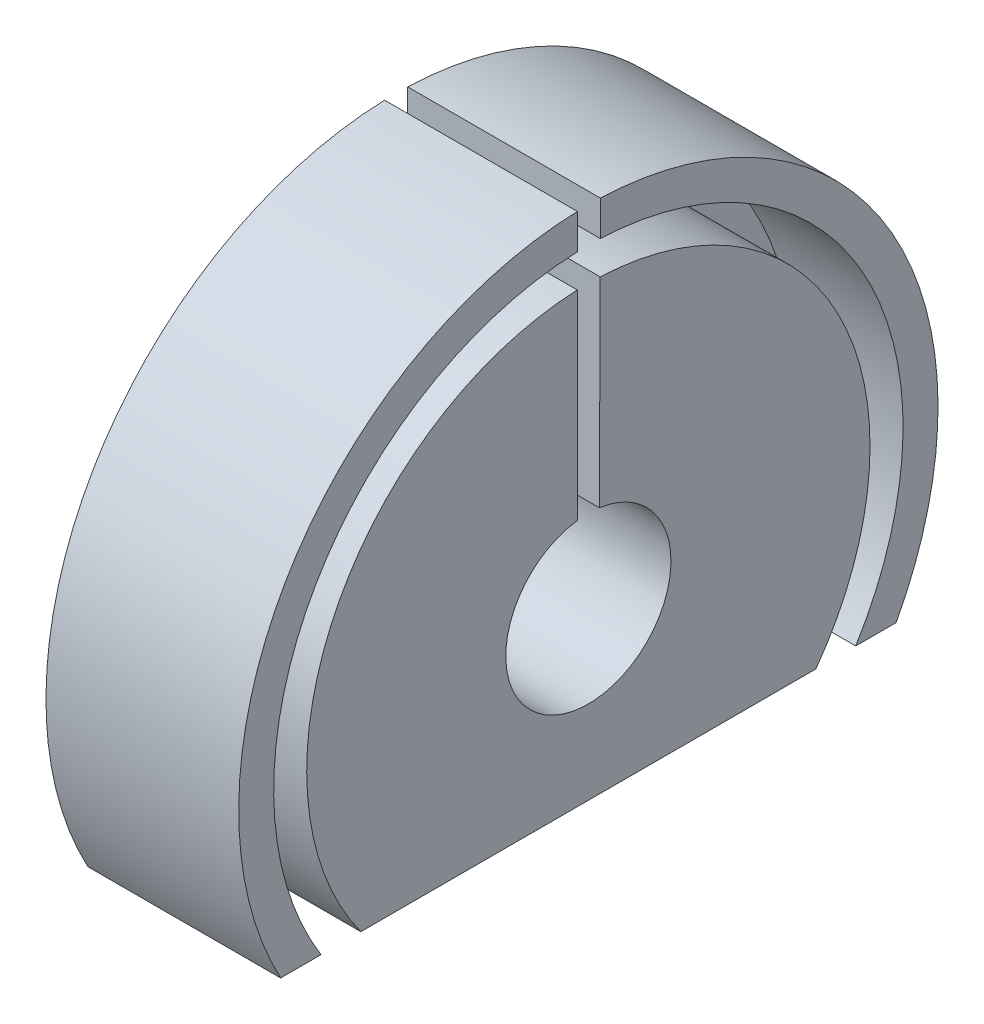
ISO-10303-21;
HEADER;
FILE_DESCRIPTION(('STEP AP214'),'2;1');
FILE_NAME('part.step','',(''),(''),'','','');
FILE_SCHEMA(('AUTOMOTIVE_DESIGN { 1 0 10303 214 1 1 1 1 }'));
ENDSEC;
DATA;
#1=APPLICATION_CONTEXT('core data for automotive mechanical design processes');
#2=APPLICATION_PROTOCOL_DEFINITION('international standard','automotive_design',2000,#1);
#3=PRODUCT_CONTEXT('',#1,'mechanical');
#4=PRODUCT('Part','Part','',(#3));
#5=PRODUCT_RELATED_PRODUCT_CATEGORY('part','',(#4));
#6=PRODUCT_DEFINITION_FORMATION('','',#4);
#7=PRODUCT_DEFINITION_CONTEXT('part definition',#1,'design');
#8=PRODUCT_DEFINITION('design','',#6,#7);
#9=PRODUCT_DEFINITION_SHAPE('','',#8);
#10=(LENGTH_UNIT() NAMED_UNIT(*) SI_UNIT(.MILLI.,.METRE.));
#11=(NAMED_UNIT(*) PLANE_ANGLE_UNIT() SI_UNIT($,.RADIAN.));
#12=(NAMED_UNIT(*) SI_UNIT($,.STERADIAN.) SOLID_ANGLE_UNIT());
#13=UNCERTAINTY_MEASURE_WITH_UNIT(LENGTH_MEASURE(1.E-05),#10,'distance_accuracy_value','');
#14=(GEOMETRIC_REPRESENTATION_CONTEXT(3) GLOBAL_UNCERTAINTY_ASSIGNED_CONTEXT((#13)) GLOBAL_UNIT_ASSIGNED_CONTEXT((#10,
#11,#12)) REPRESENTATION_CONTEXT('',''));
#15=CARTESIAN_POINT('',(0.,0.,0.));
#16=DIRECTION('',(0.,0.,1.));
#17=DIRECTION('',(1.,0.,0.));
#18=AXIS2_PLACEMENT_3D('',#15,#16,#17);
#19=CARTESIAN_POINT('',(35.,0.,0.));
#20=DIRECTION('',(-1.,0.,0.));
#21=DIRECTION('',(0.,0.,1.));
#22=AXIS2_PLACEMENT_3D('',#19,#20,#21);
#23=CYLINDRICAL_SURFACE('',#22,63.5);
#24=CARTESIAN_POINT('',(35.,0.,0.));
#25=DIRECTION('',(1.,0.,0.));
#26=DIRECTION('',(0.,0.,-1.));
#27=AXIS2_PLACEMENT_3D('',#24,#25,#26);
#28=CIRCLE('',#27,63.5);
#29=CARTESIAN_POINT('',(35.,-30.1479958641065,-55.8869246369651));
#30=VERTEX_POINT('',#29);
#31=CARTESIAN_POINT('',(35.,63.4619742229002,-2.19723183391003));
#32=VERTEX_POINT('',#31);
#33=EDGE_CURVE('E210',#30,#32,#28,.T.);
#34=ORIENTED_EDGE('',*,*,#33,.F.);
#35=DIRECTION('',(-1.,0.,0.));
#36=VECTOR('',#35,1.);
#37=CARTESIAN_POINT('',(35.,-30.1479958641065,-55.8869246369651));
#38=LINE('',#37,#36);
#39=CARTESIAN_POINT('',(0.,-30.1479958641065,-55.8869246369651));
#40=VERTEX_POINT('',#39);
#41=EDGE_CURVE('E195',#40,#30,#38,.F.);
#42=ORIENTED_EDGE('',*,*,#41,.F.);
#43=CARTESIAN_POINT('',(0.,0.,0.));
#44=DIRECTION('',(1.,0.,0.));
#45=DIRECTION('',(0.,0.,-1.));
#46=AXIS2_PLACEMENT_3D('',#43,#44,#45);
#47=CIRCLE('',#46,63.5);
#48=CARTESIAN_POINT('',(0.,63.4619742229002,-2.19723183391003));
#49=VERTEX_POINT('',#48);
#50=EDGE_CURVE('E208',#40,#49,#47,.T.);
#51=ORIENTED_EDGE('',*,*,#50,.T.);
#52=DIRECTION('',(-1.,0.,0.));
#53=VECTOR('',#52,1.);
#54=CARTESIAN_POINT('',(35.,63.4619742229002,-2.19723183391003));
#55=LINE('',#54,#53);
#56=EDGE_CURVE('E230',#32,#49,#55,.T.);
#57=ORIENTED_EDGE('',*,*,#56,.F.);
#58=EDGE_LOOP('',(#34,#42,#51,#57));
#59=FACE_BOUND('',#58,.T.);
#60=ADVANCED_FACE('F43',(#59),#23,.T.);
#61=CARTESIAN_POINT('',(35.,0.,0.));
#62=DIRECTION('',(1.,0.,0.));
#63=DIRECTION('',(0.,0.,-1.));
#64=AXIS2_PLACEMENT_3D('',#61,#62,#63);
#65=PLANE('',#64);
#66=DIRECTION('',(0.,0.,-1.));
#67=VECTOR('',#66,1.);
#68=CARTESIAN_POINT('',(35.,-30.1479958641065,-77.1974220797906));
#69=LINE('',#68,#67);
#70=CARTESIAN_POINT('',(35.,-30.1479958641065,-48.5512187836497));
#71=VERTEX_POINT('',#70);
#72=EDGE_CURVE('E364',#71,#30,#69,.T.);
#73=ORIENTED_EDGE('',*,*,#72,.T.);
#74=ORIENTED_EDGE('',*,*,#33,.T.);
#75=DIRECTION('',(0.,-0.999991763943684,0.00405857669627427));
#76=VECTOR('',#75,1.);
#77=CARTESIAN_POINT('',(35.,14.8660687473185,-2.));
#78=LINE('',#77,#76);
#79=CARTESIAN_POINT('',(35.,57.1087324328507,-2.1714465024657));
#80=VERTEX_POINT('',#79);
#81=EDGE_CURVE('E231',#32,#80,#78,.T.);
#82=ORIENTED_EDGE('',*,*,#81,.T.);
#83=CARTESIAN_POINT('',(35.,0.,0.));
#84=DIRECTION('',(1.,0.,0.));
#85=DIRECTION('',(0.,0.,-1.));
#86=AXIS2_PLACEMENT_3D('',#83,#84,#85);
#87=CIRCLE('',#86,57.15);
#88=EDGE_CURVE('E51',#80,#71,#87,.F.);
#89=ORIENTED_EDGE('',*,*,#88,.T.);
#90=EDGE_LOOP('',(#73,#74,#82,#89));
#91=FACE_BOUND('',#90,.T.);
#92=ADVANCED_FACE('F399',(#91),#65,.T.);
#93=CARTESIAN_POINT('',(15.,0.,0.));
#94=DIRECTION('',(-1.,0.,0.));
#95=DIRECTION('',(0.,0.,1.));
#96=AXIS2_PLACEMENT_3D('',#93,#94,#95);
#97=PLANE('',#96);
#98=CARTESIAN_POINT('',(15.,0.,0.));
#99=DIRECTION('',(-1.,0.,0.));
#100=DIRECTION('',(0.,0.,1.));
#101=AXIS2_PLACEMENT_3D('',#98,#99,#100);
#102=CIRCLE('',#101,57.15);
#103=CARTESIAN_POINT('',(15.,-30.1479958641065,48.5512187836497));
#104=VERTEX_POINT('',#103);
#105=CARTESIAN_POINT('',(15.,57.1149936531556,2.));
#106=VERTEX_POINT('',#105);
#107=EDGE_CURVE('E261',#104,#106,#102,.T.);
#108=ORIENTED_EDGE('',*,*,#107,.F.);
#109=DIRECTION('',(0.,0.,1.));
#110=VECTOR('',#109,1.);
#111=CARTESIAN_POINT('',(15.,-30.1479958641065,-77.1974220797906));
#112=LINE('',#111,#110);
#113=CARTESIAN_POINT('',(15.,-30.1479958641065,41.320949231326));
#114=VERTEX_POINT('',#113);
#115=EDGE_CURVE('E366',#114,#104,#112,.T.);
#116=ORIENTED_EDGE('',*,*,#115,.F.);
#117=CARTESIAN_POINT('',(15.,0.,0.));
#118=DIRECTION('',(-1.,0.,0.));
#119=DIRECTION('',(0.,0.,1.));
#120=AXIS2_PLACEMENT_3D('',#117,#118,#119);
#121=CIRCLE('',#120,51.15);
#122=CARTESIAN_POINT('',(15.,51.1108843594004,2.));
#123=VERTEX_POINT('',#122);
#124=EDGE_CURVE('E361',#114,#123,#121,.T.);
#125=ORIENTED_EDGE('',*,*,#124,.T.);
#126=DIRECTION('',(0.,-1.,0.));
#127=VECTOR('',#126,1.);
#128=CARTESIAN_POINT('',(15.,14.8660687473185,2.));
#129=LINE('',#128,#127);
#130=EDGE_CURVE('E265',#106,#123,#129,.T.);
#131=ORIENTED_EDGE('',*,*,#130,.F.);
#132=EDGE_LOOP('',(#108,#116,#125,#131));
#133=FACE_BOUND('',#132,.T.);
#134=ADVANCED_FACE('F405',(#133),#97,.F.);
#135=CARTESIAN_POINT('',(15.,0.,0.));
#136=DIRECTION('',(1.,0.,0.));
#137=DIRECTION('',(0.,0.,-1.));
#138=AXIS2_PLACEMENT_3D('',#135,#136,#137);
#139=CYLINDRICAL_SURFACE('',#138,57.15);
#140=DIRECTION('',(1.,0.,0.));
#141=VECTOR('',#140,1.);
#142=CARTESIAN_POINT('',(15.,-30.1479958641065,48.5512187836497));
#143=LINE('',#142,#141);
#144=CARTESIAN_POINT('',(35.,-30.1479958641065,48.5512187836497));
#145=VERTEX_POINT('',#144);
#146=EDGE_CURVE('E362',#145,#104,#143,.F.);
#147=ORIENTED_EDGE('',*,*,#146,.T.);
#148=ORIENTED_EDGE('',*,*,#107,.T.);
#149=DIRECTION('',(1.,0.,0.));
#150=VECTOR('',#149,1.);
#151=CARTESIAN_POINT('',(15.,57.1149936531556,2.));
#152=LINE('',#151,#150);
#153=CARTESIAN_POINT('',(35.,57.1149936531556,2.));
#154=VERTEX_POINT('',#153);
#155=EDGE_CURVE('E258',#106,#154,#152,.T.);
#156=ORIENTED_EDGE('',*,*,#155,.T.);
#157=EDGE_CURVE('E241',#145,#154,#87,.F.);
#158=ORIENTED_EDGE('',*,*,#157,.F.);
#159=EDGE_LOOP('',(#147,#148,#156,#158));
#160=FACE_BOUND('',#159,.T.);
#161=ADVANCED_FACE('F259',(#160),#139,.F.);
#162=CARTESIAN_POINT('',(15.,0.,0.));
#163=DIRECTION('',(1.,0.,0.));
#164=DIRECTION('',(0.,0.,-1.));
#165=AXIS2_PLACEMENT_3D('',#162,#163,#164);
#166=CYLINDRICAL_SURFACE('',#165,51.15);
#167=ORIENTED_EDGE('',*,*,#124,.F.);
#168=DIRECTION('',(1.,0.,0.));
#169=VECTOR('',#168,1.);
#170=CARTESIAN_POINT('',(15.,-30.1479958641065,41.320949231326));
#171=LINE('',#170,#169);
#172=CARTESIAN_POINT('',(35.,-30.1479958641065,41.320949231326));
#173=VERTEX_POINT('',#172);
#174=EDGE_CURVE('E370',#173,#114,#171,.F.);
#175=ORIENTED_EDGE('',*,*,#174,.F.);
#176=CARTESIAN_POINT('',(35.,0.,0.));
#177=DIRECTION('',(1.,0.,0.));
#178=DIRECTION('',(0.,0.,-1.));
#179=AXIS2_PLACEMENT_3D('',#176,#177,#178);
#180=CIRCLE('',#179,51.15);
#181=CARTESIAN_POINT('',(35.,51.1108843594004,2.));
#182=VERTEX_POINT('',#181);
#183=EDGE_CURVE('E239',#173,#182,#180,.F.);
#184=ORIENTED_EDGE('',*,*,#183,.T.);
#185=DIRECTION('',(1.,0.,0.));
#186=VECTOR('',#185,1.);
#187=CARTESIAN_POINT('',(15.,51.1108843594004,2.));
#188=LINE('',#187,#186);
#189=EDGE_CURVE('E351',#123,#182,#188,.T.);
#190=ORIENTED_EDGE('',*,*,#189,.F.);
#191=EDGE_LOOP('',(#167,#175,#184,#190));
#192=FACE_BOUND('',#191,.T.);
#193=ADVANCED_FACE('F386',(#192),#166,.T.);
#194=CARTESIAN_POINT('',(35.,14.8660687473185,2.));
#195=DIRECTION('',(0.,0.,1.));
#196=DIRECTION('',(1.,0.,0.));
#197=AXIS2_PLACEMENT_3D('',#194,#195,#196);
#198=PLANE('',#197);
#199=ORIENTED_EDGE('',*,*,#155,.F.);
#200=ORIENTED_EDGE('',*,*,#130,.T.);
#201=ORIENTED_EDGE('',*,*,#189,.T.);
#202=DIRECTION('',(0.,1.,0.));
#203=VECTOR('',#202,1.);
#204=CARTESIAN_POINT('',(35.,14.8660687473185,2.));
#205=LINE('',#204,#203);
#206=CARTESIAN_POINT('',(35.,14.8660687473185,2.));
#207=VERTEX_POINT('',#206);
#208=EDGE_CURVE('E270',#207,#182,#205,.T.);
#209=ORIENTED_EDGE('',*,*,#208,.F.);
#210=DIRECTION('',(-1.,0.,0.));
#211=VECTOR('',#210,1.);
#212=CARTESIAN_POINT('',(35.,14.8660687473185,2.));
#213=LINE('',#212,#211);
#214=CARTESIAN_POINT('',(0.,14.8660687473185,2.));
#215=VERTEX_POINT('',#214);
#216=EDGE_CURVE('E236',#207,#215,#213,.T.);
#217=ORIENTED_EDGE('',*,*,#216,.T.);
#218=DIRECTION('',(0.,1.,0.));
#219=VECTOR('',#218,1.);
#220=CARTESIAN_POINT('',(0.,14.8660687473185,2.));
#221=LINE('',#220,#219);
#222=CARTESIAN_POINT('',(0.,19.8997487421324,2.));
#223=VERTEX_POINT('',#222);
#224=EDGE_CURVE('E217',#215,#223,#221,.T.);
#225=ORIENTED_EDGE('',*,*,#224,.T.);
#226=DIRECTION('',(1.,0.,0.));
#227=VECTOR('',#226,1.);
#228=CARTESIAN_POINT('',(-12.,19.8997487421324,2.));
#229=LINE('',#228,#227);
#230=CARTESIAN_POINT('',(-12.,19.8997487421324,2.));
#231=VERTEX_POINT('',#230);
#232=EDGE_CURVE('E282',#231,#223,#229,.T.);
#233=ORIENTED_EDGE('',*,*,#232,.F.);
#234=DIRECTION('',(0.,-1.,0.));
#235=VECTOR('',#234,1.);
#236=CARTESIAN_POINT('',(-12.,19.8997487421324,2.));
#237=LINE('',#236,#235);
#238=CARTESIAN_POINT('',(-12.,43.7622417399744,2.));
#239=VERTEX_POINT('',#238);
#240=EDGE_CURVE('E316',#239,#231,#237,.T.);
#241=ORIENTED_EDGE('',*,*,#240,.F.);
#242=DIRECTION('',(1.,0.,0.));
#243=VECTOR('',#242,1.);
#244=CARTESIAN_POINT('',(-12.,43.7622417399744,2.));
#245=LINE('',#244,#243);
#246=CARTESIAN_POINT('',(0.,43.7622417399744,2.));
#247=VERTEX_POINT('',#246);
#248=EDGE_CURVE('E309',#239,#247,#245,.T.);
#249=ORIENTED_EDGE('',*,*,#248,.T.);
#250=CARTESIAN_POINT('',(0.,63.4684961220919,2.));
#251=VERTEX_POINT('',#250);
#252=EDGE_CURVE('E221',#247,#251,#221,.T.);
#253=ORIENTED_EDGE('',*,*,#252,.T.);
#254=DIRECTION('',(-1.,0.,0.));
#255=VECTOR('',#254,1.);
#256=CARTESIAN_POINT('',(35.,63.4684961220919,2.));
#257=LINE('',#256,#255);
#258=CARTESIAN_POINT('',(35.,63.4684961220919,2.));
#259=VERTEX_POINT('',#258);
#260=EDGE_CURVE('E233',#259,#251,#257,.T.);
#261=ORIENTED_EDGE('',*,*,#260,.F.);
#262=EDGE_CURVE('E252',#154,#259,#205,.T.);
#263=ORIENTED_EDGE('',*,*,#262,.F.);
#264=EDGE_LOOP('',(#199,#200,#201,#209,#217,#225,#233,#241,#249,#253,#261,#263));
#265=FACE_BOUND('',#264,.T.);
#266=ADVANCED_FACE('F268',(#265),#198,.F.);
#267=CARTESIAN_POINT('',(35.,14.8660687473185,-2.));
#268=DIRECTION('',(0.,-0.00405857669627427,-0.999991763943684));
#269=DIRECTION('',(0.,0.999991763943684,-0.00405857669627427));
#270=AXIS2_PLACEMENT_3D('',#267,#268,#269);
#271=PLANE('',#270);
#272=DIRECTION('',(1.,0.,0.));
#273=VECTOR('',#272,1.);
#274=CARTESIAN_POINT('',(15.,57.1087324328507,-2.1714465024657));
#275=LINE('',#274,#273);
#276=CARTESIAN_POINT('',(15.,57.1087324328507,-2.1714465024657));
#277=VERTEX_POINT('',#276);
#278=EDGE_CURVE('E266',#80,#277,#275,.F.);
#279=ORIENTED_EDGE('',*,*,#278,.F.);
#280=ORIENTED_EDGE('',*,*,#81,.F.);
#281=ORIENTED_EDGE('',*,*,#56,.T.);
#282=DIRECTION('',(0.,-0.999991763943684,0.00405857669627427));
#283=VECTOR('',#282,1.);
#284=CARTESIAN_POINT('',(0.,14.8660687473185,-2.));
#285=LINE('',#284,#283);
#286=CARTESIAN_POINT('',(0.,43.762241739982,-2.1172783002302));
#287=VERTEX_POINT('',#286);
#288=EDGE_CURVE('E215',#49,#287,#285,.T.);
#289=ORIENTED_EDGE('',*,*,#288,.T.);
#290=CARTESIAN_POINT('',(0.,14.8660687473185,-2.));
#291=VERTEX_POINT('',#290);
#292=EDGE_CURVE('E219',#287,#291,#285,.T.);
#293=ORIENTED_EDGE('',*,*,#292,.T.);
#294=DIRECTION('',(-1.,0.,0.));
#295=VECTOR('',#294,1.);
#296=CARTESIAN_POINT('',(35.,14.8660687473185,-2.));
#297=LINE('',#296,#295);
#298=CARTESIAN_POINT('',(35.,14.8660687473185,-2.));
#299=VERTEX_POINT('',#298);
#300=EDGE_CURVE('E227',#299,#291,#297,.T.);
#301=ORIENTED_EDGE('',*,*,#300,.F.);
#302=CARTESIAN_POINT('',(35.,51.1049170847186,-2.14707935671585));
#303=VERTEX_POINT('',#302);
#304=EDGE_CURVE('E279',#303,#299,#78,.T.);
#305=ORIENTED_EDGE('',*,*,#304,.F.);
#306=DIRECTION('',(1.,0.,0.));
#307=VECTOR('',#306,1.);
#308=CARTESIAN_POINT('',(15.,51.1049170847186,-2.14707935671585));
#309=LINE('',#308,#307);
#310=CARTESIAN_POINT('',(15.,51.1049170847186,-2.14707935671585));
#311=VERTEX_POINT('',#310);
#312=EDGE_CURVE('E66',#303,#311,#309,.F.);
#313=ORIENTED_EDGE('',*,*,#312,.T.);
#314=DIRECTION('',(0.,0.999991763943684,-0.00405857669627427));
#315=VECTOR('',#314,1.);
#316=CARTESIAN_POINT('',(15.,14.8660687473185,-2.));
#317=LINE('',#316,#315);
#318=EDGE_CURVE('E13',#311,#277,#317,.T.);
#319=ORIENTED_EDGE('',*,*,#318,.T.);
#320=EDGE_LOOP('',(#279,#280,#281,#289,#293,#301,#305,#313,#319));
#321=FACE_BOUND('',#320,.T.);
#322=ADVANCED_FACE('F455',(#321),#271,.F.);
#323=DIRECTION('',(0.,0.,-1.));
#324=VECTOR('',#323,1.);
#325=CARTESIAN_POINT('',(35.,-30.1479958641065,-77.1974220797906));
#326=LINE('',#325,#324);
#327=CARTESIAN_POINT('',(35.,-30.1479958641065,-41.320949231326));
#328=VERTEX_POINT('',#327);
#329=EDGE_CURVE('E372',#173,#328,#326,.T.);
#330=ORIENTED_EDGE('',*,*,#329,.T.);
#331=EDGE_CURVE('E240',#303,#328,#180,.F.);
#332=ORIENTED_EDGE('',*,*,#331,.F.);
#333=ORIENTED_EDGE('',*,*,#304,.T.);
#334=CARTESIAN_POINT('',(35.,0.,0.));
#335=DIRECTION('',(-1.,0.,0.));
#336=DIRECTION('',(0.,0.,-1.));
#337=AXIS2_PLACEMENT_3D('',#334,#335,#336);
#338=CIRCLE('',#337,15.);
#339=EDGE_CURVE('E226',#299,#207,#338,.T.);
#340=ORIENTED_EDGE('',*,*,#339,.T.);
#341=ORIENTED_EDGE('',*,*,#208,.T.);
#342=ORIENTED_EDGE('',*,*,#183,.F.);
#343=EDGE_LOOP('',(#330,#332,#333,#340,#341,#342));
#344=FACE_BOUND('',#343,.T.);
#345=ADVANCED_FACE('F380',(#344),#65,.T.);
#346=CARTESIAN_POINT('',(0.,0.,0.));
#347=DIRECTION('',(1.,0.,0.));
#348=DIRECTION('',(0.,0.,-1.));
#349=AXIS2_PLACEMENT_3D('',#346,#347,#348);
#350=PLANE('',#349);
#351=ORIENTED_EDGE('',*,*,#50,.F.);
#352=DIRECTION('',(0.,0.,-1.));
#353=VECTOR('',#352,1.);
#354=CARTESIAN_POINT('',(0.,-30.1479958641065,-77.1974220797906));
#355=LINE('',#354,#353);
#356=CARTESIAN_POINT('',(0.,-30.1479958641065,55.8869246369651));
#357=VERTEX_POINT('',#356);
#358=EDGE_CURVE('E192',#357,#40,#355,.T.);
#359=ORIENTED_EDGE('',*,*,#358,.F.);
#360=EDGE_CURVE('E216',#251,#357,#47,.T.);
#361=ORIENTED_EDGE('',*,*,#360,.F.);
#362=ORIENTED_EDGE('',*,*,#252,.F.);
#363=DIRECTION('',(0.,0.,-1.));
#364=VECTOR('',#363,1.);
#365=CARTESIAN_POINT('',(0.,43.7622417399744,12.9131853004783));
#366=LINE('',#365,#364);
#367=CARTESIAN_POINT('',(0.,43.7622417399744,12.9131853004783));
#368=VERTEX_POINT('',#367);
#369=EDGE_CURVE('E313',#368,#247,#366,.T.);
#370=ORIENTED_EDGE('',*,*,#369,.F.);
#371=DIRECTION('',(0.,1.,0.));
#372=VECTOR('',#371,1.);
#373=CARTESIAN_POINT('',(0.,43.7622417399744,12.9131853004783));
#374=LINE('',#373,#372);
#375=CARTESIAN_POINT('',(0.,27.0785827804099,12.9131853004783));
#376=VERTEX_POINT('',#375);
#377=EDGE_CURVE('E317',#376,#368,#374,.T.);
#378=ORIENTED_EDGE('',*,*,#377,.F.);
#379=CARTESIAN_POINT('',(0.,0.,0.));
#380=DIRECTION('',(-1.,0.,0.));
#381=DIRECTION('',(0.,0.,1.));
#382=AXIS2_PLACEMENT_3D('',#379,#380,#381);
#383=CIRCLE('',#382,30.);
#384=CARTESIAN_POINT('',(0.,27.0785827804099,-12.9131853004783));
#385=VERTEX_POINT('',#384);
#386=EDGE_CURVE('E320',#385,#376,#383,.T.);
#387=ORIENTED_EDGE('',*,*,#386,.F.);
#388=DIRECTION('',(0.,-1.,0.));
#389=VECTOR('',#388,1.);
#390=CARTESIAN_POINT('',(0.,43.7622417399744,-12.9131853004783));
#391=LINE('',#390,#389);
#392=CARTESIAN_POINT('',(0.,43.7622417399744,-12.9131853004783));
#393=VERTEX_POINT('',#392);
#394=EDGE_CURVE('E323',#393,#385,#391,.T.);
#395=ORIENTED_EDGE('',*,*,#394,.F.);
#396=DIRECTION('',(0.,0.,-1.));
#397=VECTOR('',#396,1.);
#398=CARTESIAN_POINT('',(0.,43.7622417399744,-2.11727830023019));
#399=LINE('',#398,#397);
#400=EDGE_CURVE('E326',#287,#393,#399,.T.);
#401=ORIENTED_EDGE('',*,*,#400,.F.);
#402=ORIENTED_EDGE('',*,*,#288,.F.);
#403=EDGE_LOOP('',(#351,#359,#361,#362,#370,#378,#387,#395,#401,#402));
#404=FACE_BOUND('',#403,.T.);
#405=ADVANCED_FACE('F213',(#404),#350,.F.);
#406=DIRECTION('',(0.,1.,0.));
#407=VECTOR('',#406,1.);
#408=CARTESIAN_POINT('',(0.,19.8876125414635,-2.11727830023019));
#409=LINE('',#408,#407);
#410=CARTESIAN_POINT('',(0.,19.8876125414635,-2.11727830023019));
#411=VERTEX_POINT('',#410);
#412=EDGE_CURVE('E329',#411,#287,#409,.T.);
#413=ORIENTED_EDGE('',*,*,#412,.F.);
#414=CARTESIAN_POINT('',(0.,0.,0.));
#415=DIRECTION('',(1.,0.,0.));
#416=DIRECTION('',(0.,0.,1.));
#417=AXIS2_PLACEMENT_3D('',#414,#415,#416);
#418=CIRCLE('',#417,20.);
#419=EDGE_CURVE('E332',#223,#411,#418,.T.);
#420=ORIENTED_EDGE('',*,*,#419,.F.);
#421=ORIENTED_EDGE('',*,*,#224,.F.);
#422=CARTESIAN_POINT('',(0.,0.,0.));
#423=DIRECTION('',(-1.,0.,0.));
#424=DIRECTION('',(0.,0.,-1.));
#425=AXIS2_PLACEMENT_3D('',#422,#423,#424);
#426=CIRCLE('',#425,15.);
#427=EDGE_CURVE('E280',#291,#215,#426,.T.);
#428=ORIENTED_EDGE('',*,*,#427,.F.);
#429=ORIENTED_EDGE('',*,*,#292,.F.);
#430=EDGE_LOOP('',(#413,#420,#421,#428,#429));
#431=FACE_BOUND('',#430,.T.);
#432=ADVANCED_FACE('F415',(#431),#350,.F.);
#433=CARTESIAN_POINT('',(35.,0.,0.));
#434=DIRECTION('',(-1.,0.,0.));
#435=DIRECTION('',(0.,0.,1.));
#436=AXIS2_PLACEMENT_3D('',#433,#434,#435);
#437=CYLINDRICAL_SURFACE('',#436,15.);
#438=ORIENTED_EDGE('',*,*,#427,.T.);
#439=ORIENTED_EDGE('',*,*,#216,.F.);
#440=ORIENTED_EDGE('',*,*,#339,.F.);
#441=ORIENTED_EDGE('',*,*,#300,.T.);
#442=EDGE_LOOP('',(#438,#439,#440,#441));
#443=FACE_BOUND('',#442,.T.);
#444=ADVANCED_FACE('F45',(#443),#437,.F.);
#445=ORIENTED_EDGE('',*,*,#360,.T.);
#446=DIRECTION('',(-1.,0.,0.));
#447=VECTOR('',#446,1.);
#448=CARTESIAN_POINT('',(35.,-30.1479958641065,55.8869246369651));
#449=LINE('',#448,#447);
#450=CARTESIAN_POINT('',(35.,-30.1479958641065,55.8869246369651));
#451=VERTEX_POINT('',#450);
#452=EDGE_CURVE('E198',#451,#357,#449,.T.);
#453=ORIENTED_EDGE('',*,*,#452,.F.);
#454=EDGE_CURVE('E277',#259,#451,#28,.T.);
#455=ORIENTED_EDGE('',*,*,#454,.F.);
#456=ORIENTED_EDGE('',*,*,#260,.T.);
#457=EDGE_LOOP('',(#445,#453,#455,#456));
#458=FACE_BOUND('',#457,.T.);
#459=ADVANCED_FACE('F401',(#458),#23,.T.);
#460=EDGE_CURVE('E254',#451,#145,#69,.T.);
#461=ORIENTED_EDGE('',*,*,#460,.T.);
#462=ORIENTED_EDGE('',*,*,#157,.T.);
#463=ORIENTED_EDGE('',*,*,#262,.T.);
#464=ORIENTED_EDGE('',*,*,#454,.T.);
#465=EDGE_LOOP('',(#461,#462,#463,#464));
#466=FACE_BOUND('',#465,.T.);
#467=ADVANCED_FACE('F249',(#466),#65,.T.);
#468=CARTESIAN_POINT('',(-12.,0.,0.));
#469=DIRECTION('',(1.,0.,0.));
#470=DIRECTION('',(0.,0.,-1.));
#471=AXIS2_PLACEMENT_3D('',#468,#469,#470);
#472=CYLINDRICAL_SURFACE('',#471,20.);
#473=ORIENTED_EDGE('',*,*,#419,.T.);
#474=DIRECTION('',(1.,0.,0.));
#475=VECTOR('',#474,1.);
#476=CARTESIAN_POINT('',(-12.,19.8876125414635,-2.11727830023019));
#477=LINE('',#476,#475);
#478=CARTESIAN_POINT('',(-12.,19.8876125414635,-2.11727830023019));
#479=VERTEX_POINT('',#478);
#480=EDGE_CURVE('E287',#479,#411,#477,.T.);
#481=ORIENTED_EDGE('',*,*,#480,.F.);
#482=CARTESIAN_POINT('',(-12.,0.,0.));
#483=DIRECTION('',(1.,0.,0.));
#484=DIRECTION('',(0.,0.,1.));
#485=AXIS2_PLACEMENT_3D('',#482,#483,#484);
#486=CIRCLE('',#485,20.);
#487=EDGE_CURVE('E345',#231,#479,#486,.T.);
#488=ORIENTED_EDGE('',*,*,#487,.F.);
#489=ORIENTED_EDGE('',*,*,#232,.T.);
#490=EDGE_LOOP('',(#473,#481,#488,#489));
#491=FACE_BOUND('',#490,.T.);
#492=ADVANCED_FACE('F414',(#491),#472,.F.);
#493=CARTESIAN_POINT('',(-12.,19.8876125414635,-2.11727830023019));
#494=DIRECTION('',(0.,0.,-1.));
#495=DIRECTION('',(-1.,0.,0.));
#496=AXIS2_PLACEMENT_3D('',#493,#494,#495);
#497=PLANE('',#496);
#498=ORIENTED_EDGE('',*,*,#412,.T.);
#499=DIRECTION('',(1.,0.,0.));
#500=VECTOR('',#499,1.);
#501=CARTESIAN_POINT('',(-12.,43.7622417399744,-2.11727830023019));
#502=LINE('',#501,#500);
#503=CARTESIAN_POINT('',(-12.,43.7622417399744,-2.11727830023019));
#504=VERTEX_POINT('',#503);
#505=EDGE_CURVE('E292',#504,#287,#502,.T.);
#506=ORIENTED_EDGE('',*,*,#505,.F.);
#507=DIRECTION('',(0.,1.,0.));
#508=VECTOR('',#507,1.);
#509=CARTESIAN_POINT('',(-12.,19.8876125414635,-2.11727830023019));
#510=LINE('',#509,#508);
#511=EDGE_CURVE('E343',#479,#504,#510,.T.);
#512=ORIENTED_EDGE('',*,*,#511,.F.);
#513=ORIENTED_EDGE('',*,*,#480,.T.);
#514=EDGE_LOOP('',(#498,#506,#512,#513));
#515=FACE_BOUND('',#514,.T.);
#516=ADVANCED_FACE('F444',(#515),#497,.F.);
#517=CARTESIAN_POINT('',(-12.,43.7622417399744,-2.11727830023019));
#518=DIRECTION('',(0.,-1.,0.));
#519=DIRECTION('',(0.,0.,-1.));
#520=AXIS2_PLACEMENT_3D('',#517,#518,#519);
#521=PLANE('',#520);
#522=ORIENTED_EDGE('',*,*,#400,.T.);
#523=DIRECTION('',(1.,0.,0.));
#524=VECTOR('',#523,1.);
#525=CARTESIAN_POINT('',(-12.,43.7622417399744,-12.9131853004783));
#526=LINE('',#525,#524);
#527=CARTESIAN_POINT('',(-12.,43.7622417399744,-12.9131853004783));
#528=VERTEX_POINT('',#527);
#529=EDGE_CURVE('E297',#528,#393,#526,.T.);
#530=ORIENTED_EDGE('',*,*,#529,.F.);
#531=DIRECTION('',(0.,0.,-1.));
#532=VECTOR('',#531,1.);
#533=CARTESIAN_POINT('',(-12.,43.7622417399744,-2.11727830023019));
#534=LINE('',#533,#532);
#535=EDGE_CURVE('E341',#504,#528,#534,.T.);
#536=ORIENTED_EDGE('',*,*,#535,.F.);
#537=ORIENTED_EDGE('',*,*,#505,.T.);
#538=EDGE_LOOP('',(#522,#530,#536,#537));
#539=FACE_BOUND('',#538,.T.);
#540=ADVANCED_FACE('F439',(#539),#521,.F.);
#541=CARTESIAN_POINT('',(-12.,43.7622417399744,-12.9131853004783));
#542=DIRECTION('',(0.,0.,1.));
#543=DIRECTION('',(1.,0.,0.));
#544=AXIS2_PLACEMENT_3D('',#541,#542,#543);
#545=PLANE('',#544);
#546=ORIENTED_EDGE('',*,*,#394,.T.);
#547=DIRECTION('',(1.,0.,0.));
#548=VECTOR('',#547,1.);
#549=CARTESIAN_POINT('',(-12.,27.0785827804099,-12.9131853004783));
#550=LINE('',#549,#548);
#551=CARTESIAN_POINT('',(-12.,27.0785827804099,-12.9131853004783));
#552=VERTEX_POINT('',#551);
#553=EDGE_CURVE('E300',#552,#385,#550,.T.);
#554=ORIENTED_EDGE('',*,*,#553,.F.);
#555=DIRECTION('',(0.,-1.,0.));
#556=VECTOR('',#555,1.);
#557=CARTESIAN_POINT('',(-12.,43.7622417399744,-12.9131853004783));
#558=LINE('',#557,#556);
#559=EDGE_CURVE('E339',#528,#552,#558,.T.);
#560=ORIENTED_EDGE('',*,*,#559,.F.);
#561=ORIENTED_EDGE('',*,*,#529,.T.);
#562=EDGE_LOOP('',(#546,#554,#560,#561));
#563=FACE_BOUND('',#562,.T.);
#564=ADVANCED_FACE('F435',(#563),#545,.F.);
#565=CARTESIAN_POINT('',(-12.,0.,0.));
#566=DIRECTION('',(1.,0.,0.));
#567=DIRECTION('',(0.,0.,-1.));
#568=AXIS2_PLACEMENT_3D('',#565,#566,#567);
#569=CYLINDRICAL_SURFACE('',#568,30.);
#570=ORIENTED_EDGE('',*,*,#386,.T.);
#571=DIRECTION('',(1.,0.,0.));
#572=VECTOR('',#571,1.);
#573=CARTESIAN_POINT('',(-12.,27.0785827804099,12.9131853004783));
#574=LINE('',#573,#572);
#575=CARTESIAN_POINT('',(-12.,27.0785827804099,12.9131853004783));
#576=VERTEX_POINT('',#575);
#577=EDGE_CURVE('E303',#576,#376,#574,.T.);
#578=ORIENTED_EDGE('',*,*,#577,.F.);
#579=CARTESIAN_POINT('',(-12.,0.,0.));
#580=DIRECTION('',(-1.,0.,0.));
#581=DIRECTION('',(0.,0.,1.));
#582=AXIS2_PLACEMENT_3D('',#579,#580,#581);
#583=CIRCLE('',#582,30.);
#584=EDGE_CURVE('E337',#552,#576,#583,.T.);
#585=ORIENTED_EDGE('',*,*,#584,.F.);
#586=ORIENTED_EDGE('',*,*,#553,.T.);
#587=EDGE_LOOP('',(#570,#578,#585,#586));
#588=FACE_BOUND('',#587,.T.);
#589=ADVANCED_FACE('F431',(#588),#569,.T.);
#590=CARTESIAN_POINT('',(-12.,43.7622417399744,12.9131853004783));
#591=DIRECTION('',(0.,0.,-1.));
#592=DIRECTION('',(-1.,0.,0.));
#593=AXIS2_PLACEMENT_3D('',#590,#591,#592);
#594=PLANE('',#593);
#595=ORIENTED_EDGE('',*,*,#377,.T.);
#596=DIRECTION('',(1.,0.,0.));
#597=VECTOR('',#596,1.);
#598=CARTESIAN_POINT('',(-12.,43.7622417399744,12.9131853004783));
#599=LINE('',#598,#597);
#600=CARTESIAN_POINT('',(-12.,43.7622417399744,12.9131853004783));
#601=VERTEX_POINT('',#600);
#602=EDGE_CURVE('E306',#601,#368,#599,.T.);
#603=ORIENTED_EDGE('',*,*,#602,.F.);
#604=DIRECTION('',(0.,1.,0.));
#605=VECTOR('',#604,1.);
#606=CARTESIAN_POINT('',(-12.,43.7622417399744,12.9131853004783));
#607=LINE('',#606,#605);
#608=EDGE_CURVE('E335',#576,#601,#607,.T.);
#609=ORIENTED_EDGE('',*,*,#608,.F.);
#610=ORIENTED_EDGE('',*,*,#577,.T.);
#611=EDGE_LOOP('',(#595,#603,#609,#610));
#612=FACE_BOUND('',#611,.T.);
#613=ADVANCED_FACE('F429',(#612),#594,.F.);
#614=CARTESIAN_POINT('',(-12.,43.7622417399744,12.9131853004783));
#615=DIRECTION('',(0.,-1.,0.));
#616=DIRECTION('',(0.,0.,-1.));
#617=AXIS2_PLACEMENT_3D('',#614,#615,#616);
#618=PLANE('',#617);
#619=ORIENTED_EDGE('',*,*,#369,.T.);
#620=ORIENTED_EDGE('',*,*,#248,.F.);
#621=DIRECTION('',(0.,0.,-1.));
#622=VECTOR('',#621,1.);
#623=CARTESIAN_POINT('',(-12.,43.7622417399744,12.9131853004783));
#624=LINE('',#623,#622);
#625=EDGE_CURVE('E312',#601,#239,#624,.T.);
#626=ORIENTED_EDGE('',*,*,#625,.F.);
#627=ORIENTED_EDGE('',*,*,#602,.T.);
#628=EDGE_LOOP('',(#619,#620,#626,#627));
#629=FACE_BOUND('',#628,.T.);
#630=ADVANCED_FACE('F418',(#629),#618,.F.);
#631=CARTESIAN_POINT('',(-12.,0.,0.));
#632=DIRECTION('',(-1.,0.,0.));
#633=DIRECTION('',(0.,0.,1.));
#634=AXIS2_PLACEMENT_3D('',#631,#632,#633);
#635=PLANE('',#634);
#636=ORIENTED_EDGE('',*,*,#240,.T.);
#637=ORIENTED_EDGE('',*,*,#487,.T.);
#638=ORIENTED_EDGE('',*,*,#511,.T.);
#639=ORIENTED_EDGE('',*,*,#535,.T.);
#640=ORIENTED_EDGE('',*,*,#559,.T.);
#641=ORIENTED_EDGE('',*,*,#584,.T.);
#642=ORIENTED_EDGE('',*,*,#608,.T.);
#643=ORIENTED_EDGE('',*,*,#625,.T.);
#644=EDGE_LOOP('',(#636,#637,#638,#639,#640,#641,#642,#643));
#645=FACE_BOUND('',#644,.T.);
#646=ADVANCED_FACE('F423',(#645),#635,.T.);
#647=CARTESIAN_POINT('',(15.,-30.1479958641065,-41.320949231326));
#648=VERTEX_POINT('',#647);
#649=EDGE_CURVE('E358',#311,#648,#121,.T.);
#650=ORIENTED_EDGE('',*,*,#649,.T.);
#651=CARTESIAN_POINT('',(15.,-30.1479958641065,-48.5512187836497));
#652=VERTEX_POINT('',#651);
#653=EDGE_CURVE('E58',#652,#648,#112,.T.);
#654=ORIENTED_EDGE('',*,*,#653,.F.);
#655=EDGE_CURVE('E355',#277,#652,#102,.T.);
#656=ORIENTED_EDGE('',*,*,#655,.F.);
#657=ORIENTED_EDGE('',*,*,#318,.F.);
#658=EDGE_LOOP('',(#650,#654,#656,#657));
#659=FACE_BOUND('',#658,.T.);
#660=ADVANCED_FACE('F392',(#659),#97,.F.);
#661=DIRECTION('',(1.,0.,0.));
#662=VECTOR('',#661,1.);
#663=CARTESIAN_POINT('',(15.,-30.1479958641065,-48.5512187836497));
#664=LINE('',#663,#662);
#665=EDGE_CURVE('E367',#652,#71,#664,.T.);
#666=ORIENTED_EDGE('',*,*,#665,.T.);
#667=ORIENTED_EDGE('',*,*,#88,.F.);
#668=ORIENTED_EDGE('',*,*,#278,.T.);
#669=ORIENTED_EDGE('',*,*,#655,.T.);
#670=EDGE_LOOP('',(#666,#667,#668,#669));
#671=FACE_BOUND('',#670,.T.);
#672=ADVANCED_FACE('F384',(#671),#139,.F.);
#673=ORIENTED_EDGE('',*,*,#331,.T.);
#674=DIRECTION('',(1.,0.,0.));
#675=VECTOR('',#674,1.);
#676=CARTESIAN_POINT('',(15.,-30.1479958641065,-41.320949231326));
#677=LINE('',#676,#675);
#678=EDGE_CURVE('E203',#648,#328,#677,.T.);
#679=ORIENTED_EDGE('',*,*,#678,.F.);
#680=ORIENTED_EDGE('',*,*,#649,.F.);
#681=ORIENTED_EDGE('',*,*,#312,.F.);
#682=EDGE_LOOP('',(#673,#679,#680,#681));
#683=FACE_BOUND('',#682,.T.);
#684=ADVANCED_FACE('F382',(#683),#166,.T.);
#685=CARTESIAN_POINT('',(35.001,-30.1479958641065,-77.1974220797906));
#686=DIRECTION('',(0.,1.,0.));
#687=DIRECTION('',(0.,0.,1.));
#688=AXIS2_PLACEMENT_3D('',#685,#686,#687);
#689=PLANE('',#688);
#690=ORIENTED_EDGE('',*,*,#452,.T.);
#691=ORIENTED_EDGE('',*,*,#358,.T.);
#692=ORIENTED_EDGE('',*,*,#41,.T.);
#693=ORIENTED_EDGE('',*,*,#72,.F.);
#694=ORIENTED_EDGE('',*,*,#665,.F.);
#695=ORIENTED_EDGE('',*,*,#653,.T.);
#696=ORIENTED_EDGE('',*,*,#678,.T.);
#697=ORIENTED_EDGE('',*,*,#329,.F.);
#698=ORIENTED_EDGE('',*,*,#174,.T.);
#699=ORIENTED_EDGE('',*,*,#115,.T.);
#700=ORIENTED_EDGE('',*,*,#146,.F.);
#701=ORIENTED_EDGE('',*,*,#460,.F.);
#702=EDGE_LOOP('',(#690,#691,#692,#693,#694,#695,#696,#697,#698,#699,#700,#701));
#703=FACE_BOUND('',#702,.T.);
#704=ADVANCED_FACE('F194',(#703),#689,.F.);
#705=CLOSED_SHELL('',(#60,#92,#134,#161,#193,#266,#322,#345,#405,#432,#444,#459,#467,#492,#516,
#540,#564,#589,#613,#630,#646,#660,#672,#684,#704));
#706=MANIFOLD_SOLID_BREP('B2',#705);
#707=ADVANCED_BREP_SHAPE_REPRESENTATION('',(#18,#706),#14);
#708=SHAPE_DEFINITION_REPRESENTATION(#9,#707);
ENDSEC;
END-ISO-10303-21;
